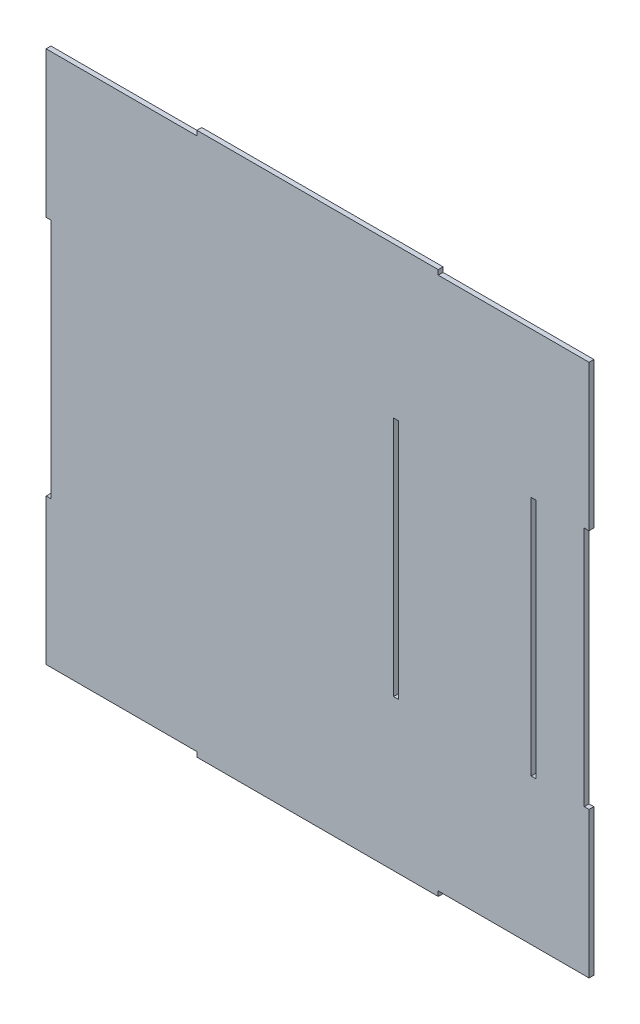
ISO-10303-21;
HEADER;
FILE_DESCRIPTION(('STEP AP214'),'2;1');
FILE_NAME('part.step','',(''),(''),'','','');
FILE_SCHEMA(('AUTOMOTIVE_DESIGN { 1 0 10303 214 1 1 1 1 }'));
ENDSEC;
DATA;
#1=APPLICATION_CONTEXT('core data for automotive mechanical design processes');
#2=APPLICATION_PROTOCOL_DEFINITION('international standard','automotive_design',2000,#1);
#3=PRODUCT_CONTEXT('',#1,'mechanical');
#4=PRODUCT('Part','Part','',(#3));
#5=PRODUCT_RELATED_PRODUCT_CATEGORY('part','',(#4));
#6=PRODUCT_DEFINITION_FORMATION('','',#4);
#7=PRODUCT_DEFINITION_CONTEXT('part definition',#1,'design');
#8=PRODUCT_DEFINITION('design','',#6,#7);
#9=PRODUCT_DEFINITION_SHAPE('','',#8);
#10=(LENGTH_UNIT() NAMED_UNIT(*) SI_UNIT(.MILLI.,.METRE.));
#11=(NAMED_UNIT(*) PLANE_ANGLE_UNIT() SI_UNIT($,.RADIAN.));
#12=(NAMED_UNIT(*) SI_UNIT($,.STERADIAN.) SOLID_ANGLE_UNIT());
#13=UNCERTAINTY_MEASURE_WITH_UNIT(LENGTH_MEASURE(1.E-05),#10,'distance_accuracy_value','');
#14=(GEOMETRIC_REPRESENTATION_CONTEXT(3) GLOBAL_UNCERTAINTY_ASSIGNED_CONTEXT((#13)) GLOBAL_UNIT_ASSIGNED_CONTEXT((#10,
#11,#12)) REPRESENTATION_CONTEXT('',''));
#15=CARTESIAN_POINT('',(0.,0.,0.));
#16=DIRECTION('',(0.,0.,1.));
#17=DIRECTION('',(1.,0.,0.));
#18=AXIS2_PLACEMENT_3D('',#15,#16,#17);
#19=CARTESIAN_POINT('',(0.,0.,4.));
#20=DIRECTION('',(0.,0.,-1.));
#21=DIRECTION('',(-1.,0.,0.));
#22=AXIS2_PLACEMENT_3D('',#19,#20,#21);
#23=PLANE('',#22);
#24=DIRECTION('',(0.,1.,0.));
#25=VECTOR('',#24,1.);
#26=CARTESIAN_POINT('',(39.0458140767459,92.4668914557469,4.));
#27=LINE('',#26,#25);
#28=CARTESIAN_POINT('',(39.0458140767459,-107.533108544253,4.));
#29=VERTEX_POINT('',#28);
#30=CARTESIAN_POINT('',(39.0458140767459,92.4668914557469,4.));
#31=VERTEX_POINT('',#30);
#32=EDGE_CURVE('E264',#29,#31,#27,.T.);
#33=ORIENTED_EDGE('',*,*,#32,.F.);
#34=DIRECTION('',(1.,0.,0.));
#35=VECTOR('',#34,1.);
#36=CARTESIAN_POINT('',(39.0458140767459,-107.533108544253,4.));
#37=LINE('',#36,#35);
#38=CARTESIAN_POINT('',(35.0458140767459,-107.533108544253,4.));
#39=VERTEX_POINT('',#38);
#40=EDGE_CURVE('E272',#39,#29,#37,.T.);
#41=ORIENTED_EDGE('',*,*,#40,.F.);
#42=DIRECTION('',(0.,-1.,0.));
#43=VECTOR('',#42,1.);
#44=CARTESIAN_POINT('',(35.0458140767459,92.4668914557469,4.));
#45=LINE('',#44,#43);
#46=CARTESIAN_POINT('',(35.0458140767459,92.4668914557469,4.));
#47=VERTEX_POINT('',#46);
#48=EDGE_CURVE('E269',#47,#39,#45,.T.);
#49=ORIENTED_EDGE('',*,*,#48,.F.);
#50=DIRECTION('',(-1.,0.,0.));
#51=VECTOR('',#50,1.);
#52=CARTESIAN_POINT('',(39.0458140767459,92.4668914557469,4.));
#53=LINE('',#52,#51);
#54=EDGE_CURVE('E266',#31,#47,#53,.T.);
#55=ORIENTED_EDGE('',*,*,#54,.F.);
#56=EDGE_LOOP('',(#33,#41,#49,#55));
#57=FACE_BOUND('',#56,.T.);
#58=DIRECTION('',(0.,-1.,0.));
#59=VECTOR('',#58,1.);
#60=CARTESIAN_POINT('',(-248.954185923254,92.4668914557465,4.));
#61=LINE('',#60,#59);
#62=CARTESIAN_POINT('',(-248.954185923254,92.4668914557465,4.));
#63=VERTEX_POINT('',#62);
#64=CARTESIAN_POINT('',(-248.954185923254,-107.533108544254,4.));
#65=VERTEX_POINT('',#64);
#66=EDGE_CURVE('E295',#63,#65,#61,.T.);
#67=ORIENTED_EDGE('',*,*,#66,.T.);
#68=DIRECTION('',(-1.,0.,0.));
#69=VECTOR('',#68,1.);
#70=CARTESIAN_POINT('',(-248.954185923254,-107.533108544254,4.));
#71=LINE('',#70,#69);
#72=CARTESIAN_POINT('',(-252.954185923254,-107.533108544254,4.));
#73=VERTEX_POINT('',#72);
#74=EDGE_CURVE('E298',#65,#73,#71,.T.);
#75=ORIENTED_EDGE('',*,*,#74,.T.);
#76=DIRECTION('',(0.,-1.,0.));
#77=VECTOR('',#76,1.);
#78=CARTESIAN_POINT('',(-252.954185923254,-107.533108544254,4.));
#79=LINE('',#78,#77);
#80=CARTESIAN_POINT('',(-252.954185923254,-228.533108544254,4.));
#81=VERTEX_POINT('',#80);
#82=EDGE_CURVE('E301',#73,#81,#79,.T.);
#83=ORIENTED_EDGE('',*,*,#82,.T.);
#84=DIRECTION('',(1.,0.,0.));
#85=VECTOR('',#84,1.);
#86=CARTESIAN_POINT('',(-252.954185923254,-228.533108544254,4.));
#87=LINE('',#86,#85);
#88=CARTESIAN_POINT('',(-127.954185923254,-228.533108544254,4.));
#89=VERTEX_POINT('',#88);
#90=EDGE_CURVE('E303',#81,#89,#87,.T.);
#91=ORIENTED_EDGE('',*,*,#90,.T.);
#92=DIRECTION('',(0.,-1.,0.));
#93=VECTOR('',#92,1.);
#94=CARTESIAN_POINT('',(-127.954185923254,-228.533108544254,4.));
#95=LINE('',#94,#93);
#96=CARTESIAN_POINT('',(-127.954185923254,-232.533108544254,4.));
#97=VERTEX_POINT('',#96);
#98=EDGE_CURVE('E305',#89,#97,#95,.T.);
#99=ORIENTED_EDGE('',*,*,#98,.T.);
#100=DIRECTION('',(1.,0.,0.));
#101=VECTOR('',#100,1.);
#102=CARTESIAN_POINT('',(-127.954185923254,-232.533108544254,4.));
#103=LINE('',#102,#101);
#104=CARTESIAN_POINT('',(72.0458140767459,-232.533108544254,4.));
#105=VERTEX_POINT('',#104);
#106=EDGE_CURVE('E307',#97,#105,#103,.T.);
#107=ORIENTED_EDGE('',*,*,#106,.T.);
#108=DIRECTION('',(0.,1.,0.));
#109=VECTOR('',#108,1.);
#110=CARTESIAN_POINT('',(72.0458140767459,-232.533108544254,4.));
#111=LINE('',#110,#109);
#112=CARTESIAN_POINT('',(72.0458140767459,-228.533108544254,4.));
#113=VERTEX_POINT('',#112);
#114=EDGE_CURVE('E309',#105,#113,#111,.T.);
#115=ORIENTED_EDGE('',*,*,#114,.T.);
#116=DIRECTION('',(1.,0.,0.));
#117=VECTOR('',#116,1.);
#118=CARTESIAN_POINT('',(72.0458140767459,-228.533108544254,4.));
#119=LINE('',#118,#117);
#120=CARTESIAN_POINT('',(197.045814076746,-228.533108544254,4.));
#121=VERTEX_POINT('',#120);
#122=EDGE_CURVE('E311',#113,#121,#119,.T.);
#123=ORIENTED_EDGE('',*,*,#122,.T.);
#124=DIRECTION('',(0.,1.,0.));
#125=VECTOR('',#124,1.);
#126=CARTESIAN_POINT('',(197.045814076746,-228.533108544254,4.));
#127=LINE('',#126,#125);
#128=CARTESIAN_POINT('',(197.045814076746,-107.533108544254,4.));
#129=VERTEX_POINT('',#128);
#130=EDGE_CURVE('E313',#121,#129,#127,.T.);
#131=ORIENTED_EDGE('',*,*,#130,.T.);
#132=DIRECTION('',(-1.,0.,0.));
#133=VECTOR('',#132,1.);
#134=CARTESIAN_POINT('',(197.045814076746,-107.533108544254,4.));
#135=LINE('',#134,#133);
#136=CARTESIAN_POINT('',(193.045814076746,-107.533108544254,4.));
#137=VERTEX_POINT('',#136);
#138=EDGE_CURVE('E315',#129,#137,#135,.T.);
#139=ORIENTED_EDGE('',*,*,#138,.T.);
#140=DIRECTION('',(0.,1.,0.));
#141=VECTOR('',#140,1.);
#142=CARTESIAN_POINT('',(193.045814076746,-107.533108544254,4.));
#143=LINE('',#142,#141);
#144=CARTESIAN_POINT('',(193.045814076746,92.4668914557465,4.));
#145=VERTEX_POINT('',#144);
#146=EDGE_CURVE('E317',#137,#145,#143,.T.);
#147=ORIENTED_EDGE('',*,*,#146,.T.);
#148=DIRECTION('',(1.,0.,0.));
#149=VECTOR('',#148,1.);
#150=CARTESIAN_POINT('',(193.045814076746,92.4668914557465,4.));
#151=LINE('',#150,#149);
#152=CARTESIAN_POINT('',(197.045814076746,92.4668914557465,4.));
#153=VERTEX_POINT('',#152);
#154=EDGE_CURVE('E319',#145,#153,#151,.T.);
#155=ORIENTED_EDGE('',*,*,#154,.T.);
#156=DIRECTION('',(0.,1.,0.));
#157=VECTOR('',#156,1.);
#158=CARTESIAN_POINT('',(197.045814076746,92.4668914557465,4.));
#159=LINE('',#158,#157);
#160=CARTESIAN_POINT('',(197.045814076746,213.466891455746,4.));
#161=VERTEX_POINT('',#160);
#162=EDGE_CURVE('E321',#153,#161,#159,.T.);
#163=ORIENTED_EDGE('',*,*,#162,.T.);
#164=DIRECTION('',(-1.,0.,0.));
#165=VECTOR('',#164,1.);
#166=CARTESIAN_POINT('',(197.045814076746,213.466891455746,4.));
#167=LINE('',#166,#165);
#168=CARTESIAN_POINT('',(72.0458140767458,213.466891455746,4.));
#169=VERTEX_POINT('',#168);
#170=EDGE_CURVE('E323',#161,#169,#167,.T.);
#171=ORIENTED_EDGE('',*,*,#170,.T.);
#172=DIRECTION('',(0.,1.,0.));
#173=VECTOR('',#172,1.);
#174=CARTESIAN_POINT('',(72.0458140767458,213.466891455746,4.));
#175=LINE('',#174,#173);
#176=CARTESIAN_POINT('',(72.0458140767458,217.466891455746,4.));
#177=VERTEX_POINT('',#176);
#178=EDGE_CURVE('E325',#169,#177,#175,.T.);
#179=ORIENTED_EDGE('',*,*,#178,.T.);
#180=DIRECTION('',(-1.,0.,0.));
#181=VECTOR('',#180,1.);
#182=CARTESIAN_POINT('',(72.0458140767458,217.466891455746,4.));
#183=LINE('',#182,#181);
#184=CARTESIAN_POINT('',(-127.954185923254,217.466891455746,4.));
#185=VERTEX_POINT('',#184);
#186=EDGE_CURVE('E327',#177,#185,#183,.T.);
#187=ORIENTED_EDGE('',*,*,#186,.T.);
#188=DIRECTION('',(0.,-1.,0.));
#189=VECTOR('',#188,1.);
#190=CARTESIAN_POINT('',(-127.954185923254,217.466891455746,4.));
#191=LINE('',#190,#189);
#192=CARTESIAN_POINT('',(-127.954185923254,213.466891455746,4.));
#193=VERTEX_POINT('',#192);
#194=EDGE_CURVE('E329',#185,#193,#191,.T.);
#195=ORIENTED_EDGE('',*,*,#194,.T.);
#196=DIRECTION('',(-1.,0.,0.));
#197=VECTOR('',#196,1.);
#198=CARTESIAN_POINT('',(-127.954185923254,213.466891455746,4.));
#199=LINE('',#198,#197);
#200=CARTESIAN_POINT('',(-252.954185923254,213.466891455746,4.));
#201=VERTEX_POINT('',#200);
#202=EDGE_CURVE('E331',#193,#201,#199,.T.);
#203=ORIENTED_EDGE('',*,*,#202,.T.);
#204=DIRECTION('',(0.,-1.,0.));
#205=VECTOR('',#204,1.);
#206=CARTESIAN_POINT('',(-252.954185923254,213.466891455746,4.));
#207=LINE('',#206,#205);
#208=CARTESIAN_POINT('',(-252.954185923254,92.4668914557465,4.));
#209=VERTEX_POINT('',#208);
#210=EDGE_CURVE('E333',#201,#209,#207,.T.);
#211=ORIENTED_EDGE('',*,*,#210,.T.);
#212=DIRECTION('',(1.,0.,0.));
#213=VECTOR('',#212,1.);
#214=CARTESIAN_POINT('',(-252.954185923254,92.4668914557465,4.));
#215=LINE('',#214,#213);
#216=EDGE_CURVE('E335',#209,#63,#215,.T.);
#217=ORIENTED_EDGE('',*,*,#216,.T.);
#218=EDGE_LOOP('',(#67,#75,#83,#91,#99,#107,#115,#123,#131,#139,#147,#155,#163,#171,#179,#187,
#195,#203,#211,#217));
#219=FACE_BOUND('',#218,.T.);
#220=DIRECTION('',(0.,-1.,0.));
#221=VECTOR('',#220,1.);
#222=CARTESIAN_POINT('',(149.045814076746,92.4668914557469,4.));
#223=LINE('',#222,#221);
#224=CARTESIAN_POINT('',(149.045814076746,92.4668914557469,4.));
#225=VERTEX_POINT('',#224);
#226=CARTESIAN_POINT('',(149.045814076746,-107.533108544253,4.));
#227=VERTEX_POINT('',#226);
#228=EDGE_CURVE('E228',#225,#227,#223,.T.);
#229=ORIENTED_EDGE('',*,*,#228,.F.);
#230=DIRECTION('',(-1.,0.,0.));
#231=VECTOR('',#230,1.);
#232=CARTESIAN_POINT('',(149.045814076746,92.4668914557469,4.));
#233=LINE('',#232,#231);
#234=CARTESIAN_POINT('',(153.045814076746,92.4668914557469,4.));
#235=VERTEX_POINT('',#234);
#236=EDGE_CURVE('E250',#235,#225,#233,.T.);
#237=ORIENTED_EDGE('',*,*,#236,.F.);
#238=DIRECTION('',(0.,1.,0.));
#239=VECTOR('',#238,1.);
#240=CARTESIAN_POINT('',(153.045814076746,92.4668914557469,4.));
#241=LINE('',#240,#239);
#242=CARTESIAN_POINT('',(153.045814076746,-107.533108544253,4.));
#243=VERTEX_POINT('',#242);
#244=EDGE_CURVE('E248',#243,#235,#241,.T.);
#245=ORIENTED_EDGE('',*,*,#244,.F.);
#246=DIRECTION('',(1.,0.,0.));
#247=VECTOR('',#246,1.);
#248=CARTESIAN_POINT('',(149.045814076746,-107.533108544253,4.));
#249=LINE('',#248,#247);
#250=EDGE_CURVE('E236',#227,#243,#249,.T.);
#251=ORIENTED_EDGE('',*,*,#250,.F.);
#252=EDGE_LOOP('',(#229,#237,#245,#251));
#253=FACE_BOUND('',#252,.T.);
#254=ADVANCED_FACE('F43',(#57,#219,#253),#23,.F.);
#255=CARTESIAN_POINT('',(0.,0.,0.));
#256=DIRECTION('',(0.,0.,-1.));
#257=DIRECTION('',(-1.,0.,0.));
#258=AXIS2_PLACEMENT_3D('',#255,#256,#257);
#259=PLANE('',#258);
#260=DIRECTION('',(0.,-1.,0.));
#261=VECTOR('',#260,1.);
#262=CARTESIAN_POINT('',(-248.954185923254,92.4668914557465,0.));
#263=LINE('',#262,#261);
#264=CARTESIAN_POINT('',(-248.954185923254,92.4668914557465,0.));
#265=VERTEX_POINT('',#264);
#266=CARTESIAN_POINT('',(-248.954185923254,-107.533108544254,0.));
#267=VERTEX_POINT('',#266);
#268=EDGE_CURVE('E294',#265,#267,#263,.T.);
#269=ORIENTED_EDGE('',*,*,#268,.F.);
#270=DIRECTION('',(1.,0.,0.));
#271=VECTOR('',#270,1.);
#272=CARTESIAN_POINT('',(-252.954185923254,92.4668914557465,0.));
#273=LINE('',#272,#271);
#274=CARTESIAN_POINT('',(-252.954185923254,92.4668914557465,0.));
#275=VERTEX_POINT('',#274);
#276=EDGE_CURVE('E299',#275,#265,#273,.T.);
#277=ORIENTED_EDGE('',*,*,#276,.F.);
#278=DIRECTION('',(0.,-1.,0.));
#279=VECTOR('',#278,1.);
#280=CARTESIAN_POINT('',(-252.954185923254,213.466891455746,0.));
#281=LINE('',#280,#279);
#282=CARTESIAN_POINT('',(-252.954185923254,213.466891455746,0.));
#283=VERTEX_POINT('',#282);
#284=EDGE_CURVE('E374',#283,#275,#281,.T.);
#285=ORIENTED_EDGE('',*,*,#284,.F.);
#286=DIRECTION('',(-1.,0.,0.));
#287=VECTOR('',#286,1.);
#288=CARTESIAN_POINT('',(-127.954185923254,213.466891455746,0.));
#289=LINE('',#288,#287);
#290=CARTESIAN_POINT('',(-127.954185923254,213.466891455746,0.));
#291=VERTEX_POINT('',#290);
#292=EDGE_CURVE('E372',#291,#283,#289,.T.);
#293=ORIENTED_EDGE('',*,*,#292,.F.);
#294=DIRECTION('',(0.,-1.,0.));
#295=VECTOR('',#294,1.);
#296=CARTESIAN_POINT('',(-127.954185923254,217.466891455746,0.));
#297=LINE('',#296,#295);
#298=CARTESIAN_POINT('',(-127.954185923254,217.466891455746,0.));
#299=VERTEX_POINT('',#298);
#300=EDGE_CURVE('E370',#299,#291,#297,.T.);
#301=ORIENTED_EDGE('',*,*,#300,.F.);
#302=DIRECTION('',(-1.,0.,0.));
#303=VECTOR('',#302,1.);
#304=CARTESIAN_POINT('',(72.0458140767458,217.466891455746,0.));
#305=LINE('',#304,#303);
#306=CARTESIAN_POINT('',(72.0458140767458,217.466891455746,0.));
#307=VERTEX_POINT('',#306);
#308=EDGE_CURVE('E368',#307,#299,#305,.T.);
#309=ORIENTED_EDGE('',*,*,#308,.F.);
#310=DIRECTION('',(0.,1.,0.));
#311=VECTOR('',#310,1.);
#312=CARTESIAN_POINT('',(72.0458140767458,213.466891455746,0.));
#313=LINE('',#312,#311);
#314=CARTESIAN_POINT('',(72.0458140767458,213.466891455746,0.));
#315=VERTEX_POINT('',#314);
#316=EDGE_CURVE('E366',#315,#307,#313,.T.);
#317=ORIENTED_EDGE('',*,*,#316,.F.);
#318=DIRECTION('',(-1.,0.,0.));
#319=VECTOR('',#318,1.);
#320=CARTESIAN_POINT('',(197.045814076746,213.466891455746,0.));
#321=LINE('',#320,#319);
#322=CARTESIAN_POINT('',(197.045814076746,213.466891455746,0.));
#323=VERTEX_POINT('',#322);
#324=EDGE_CURVE('E364',#323,#315,#321,.T.);
#325=ORIENTED_EDGE('',*,*,#324,.F.);
#326=DIRECTION('',(0.,1.,0.));
#327=VECTOR('',#326,1.);
#328=CARTESIAN_POINT('',(197.045814076746,92.4668914557465,0.));
#329=LINE('',#328,#327);
#330=CARTESIAN_POINT('',(197.045814076746,92.4668914557465,0.));
#331=VERTEX_POINT('',#330);
#332=EDGE_CURVE('E362',#331,#323,#329,.T.);
#333=ORIENTED_EDGE('',*,*,#332,.F.);
#334=DIRECTION('',(1.,0.,0.));
#335=VECTOR('',#334,1.);
#336=CARTESIAN_POINT('',(193.045814076746,92.4668914557465,0.));
#337=LINE('',#336,#335);
#338=CARTESIAN_POINT('',(193.045814076746,92.4668914557465,0.));
#339=VERTEX_POINT('',#338);
#340=EDGE_CURVE('E360',#339,#331,#337,.T.);
#341=ORIENTED_EDGE('',*,*,#340,.F.);
#342=DIRECTION('',(0.,1.,0.));
#343=VECTOR('',#342,1.);
#344=CARTESIAN_POINT('',(193.045814076746,-107.533108544254,0.));
#345=LINE('',#344,#343);
#346=CARTESIAN_POINT('',(193.045814076746,-107.533108544254,0.));
#347=VERTEX_POINT('',#346);
#348=EDGE_CURVE('E358',#347,#339,#345,.T.);
#349=ORIENTED_EDGE('',*,*,#348,.F.);
#350=DIRECTION('',(-1.,0.,0.));
#351=VECTOR('',#350,1.);
#352=CARTESIAN_POINT('',(197.045814076746,-107.533108544254,0.));
#353=LINE('',#352,#351);
#354=CARTESIAN_POINT('',(197.045814076746,-107.533108544254,0.));
#355=VERTEX_POINT('',#354);
#356=EDGE_CURVE('E356',#355,#347,#353,.T.);
#357=ORIENTED_EDGE('',*,*,#356,.F.);
#358=DIRECTION('',(0.,1.,0.));
#359=VECTOR('',#358,1.);
#360=CARTESIAN_POINT('',(197.045814076746,-228.533108544254,0.));
#361=LINE('',#360,#359);
#362=CARTESIAN_POINT('',(197.045814076746,-228.533108544254,0.));
#363=VERTEX_POINT('',#362);
#364=EDGE_CURVE('E354',#363,#355,#361,.T.);
#365=ORIENTED_EDGE('',*,*,#364,.F.);
#366=DIRECTION('',(1.,0.,0.));
#367=VECTOR('',#366,1.);
#368=CARTESIAN_POINT('',(72.0458140767459,-228.533108544254,0.));
#369=LINE('',#368,#367);
#370=CARTESIAN_POINT('',(72.0458140767459,-228.533108544254,0.));
#371=VERTEX_POINT('',#370);
#372=EDGE_CURVE('E352',#371,#363,#369,.T.);
#373=ORIENTED_EDGE('',*,*,#372,.F.);
#374=DIRECTION('',(0.,1.,0.));
#375=VECTOR('',#374,1.);
#376=CARTESIAN_POINT('',(72.0458140767459,-232.533108544254,0.));
#377=LINE('',#376,#375);
#378=CARTESIAN_POINT('',(72.0458140767459,-232.533108544254,0.));
#379=VERTEX_POINT('',#378);
#380=EDGE_CURVE('E350',#379,#371,#377,.T.);
#381=ORIENTED_EDGE('',*,*,#380,.F.);
#382=DIRECTION('',(1.,0.,0.));
#383=VECTOR('',#382,1.);
#384=CARTESIAN_POINT('',(-127.954185923254,-232.533108544254,0.));
#385=LINE('',#384,#383);
#386=CARTESIAN_POINT('',(-127.954185923254,-232.533108544254,0.));
#387=VERTEX_POINT('',#386);
#388=EDGE_CURVE('E348',#387,#379,#385,.T.);
#389=ORIENTED_EDGE('',*,*,#388,.F.);
#390=DIRECTION('',(0.,-1.,0.));
#391=VECTOR('',#390,1.);
#392=CARTESIAN_POINT('',(-127.954185923254,-228.533108544254,0.));
#393=LINE('',#392,#391);
#394=CARTESIAN_POINT('',(-127.954185923254,-228.533108544254,0.));
#395=VERTEX_POINT('',#394);
#396=EDGE_CURVE('E346',#395,#387,#393,.T.);
#397=ORIENTED_EDGE('',*,*,#396,.F.);
#398=DIRECTION('',(1.,0.,0.));
#399=VECTOR('',#398,1.);
#400=CARTESIAN_POINT('',(-252.954185923254,-228.533108544254,0.));
#401=LINE('',#400,#399);
#402=CARTESIAN_POINT('',(-252.954185923254,-228.533108544254,0.));
#403=VERTEX_POINT('',#402);
#404=EDGE_CURVE('E344',#403,#395,#401,.T.);
#405=ORIENTED_EDGE('',*,*,#404,.F.);
#406=DIRECTION('',(0.,-1.,0.));
#407=VECTOR('',#406,1.);
#408=CARTESIAN_POINT('',(-252.954185923254,-107.533108544254,0.));
#409=LINE('',#408,#407);
#410=CARTESIAN_POINT('',(-252.954185923254,-107.533108544254,0.));
#411=VERTEX_POINT('',#410);
#412=EDGE_CURVE('E342',#411,#403,#409,.T.);
#413=ORIENTED_EDGE('',*,*,#412,.F.);
#414=DIRECTION('',(-1.,0.,0.));
#415=VECTOR('',#414,1.);
#416=CARTESIAN_POINT('',(-248.954185923254,-107.533108544254,0.));
#417=LINE('',#416,#415);
#418=EDGE_CURVE('E340',#267,#411,#417,.T.);
#419=ORIENTED_EDGE('',*,*,#418,.F.);
#420=EDGE_LOOP('',(#269,#277,#285,#293,#301,#309,#317,#325,#333,#341,#349,#357,#365,#373,#381,
#389,#397,#405,#413,#419));
#421=FACE_BOUND('',#420,.T.);
#422=DIRECTION('',(1.,0.,0.));
#423=VECTOR('',#422,1.);
#424=CARTESIAN_POINT('',(39.0458140767459,-107.533108544253,0.));
#425=LINE('',#424,#423);
#426=CARTESIAN_POINT('',(35.0458140767459,-107.533108544253,0.));
#427=VERTEX_POINT('',#426);
#428=CARTESIAN_POINT('',(39.0458140767459,-107.533108544253,0.));
#429=VERTEX_POINT('',#428);
#430=EDGE_CURVE('E267',#427,#429,#425,.T.);
#431=ORIENTED_EDGE('',*,*,#430,.T.);
#432=DIRECTION('',(0.,1.,0.));
#433=VECTOR('',#432,1.);
#434=CARTESIAN_POINT('',(39.0458140767459,92.4668914557469,0.));
#435=LINE('',#434,#433);
#436=CARTESIAN_POINT('',(39.0458140767459,92.4668914557469,0.));
#437=VERTEX_POINT('',#436);
#438=EDGE_CURVE('E244',#429,#437,#435,.T.);
#439=ORIENTED_EDGE('',*,*,#438,.T.);
#440=DIRECTION('',(-1.,0.,0.));
#441=VECTOR('',#440,1.);
#442=CARTESIAN_POINT('',(39.0458140767459,92.4668914557469,0.));
#443=LINE('',#442,#441);
#444=CARTESIAN_POINT('',(35.0458140767459,92.4668914557469,0.));
#445=VERTEX_POINT('',#444);
#446=EDGE_CURVE('E277',#437,#445,#443,.T.);
#447=ORIENTED_EDGE('',*,*,#446,.T.);
#448=DIRECTION('',(0.,-1.,0.));
#449=VECTOR('',#448,1.);
#450=CARTESIAN_POINT('',(35.0458140767459,92.4668914557469,0.));
#451=LINE('',#450,#449);
#452=EDGE_CURVE('E280',#445,#427,#451,.T.);
#453=ORIENTED_EDGE('',*,*,#452,.T.);
#454=EDGE_LOOP('',(#431,#439,#447,#453));
#455=FACE_BOUND('',#454,.T.);
#456=DIRECTION('',(-1.,0.,0.));
#457=VECTOR('',#456,1.);
#458=CARTESIAN_POINT('',(149.045814076746,92.4668914557469,0.));
#459=LINE('',#458,#457);
#460=CARTESIAN_POINT('',(153.045814076746,92.4668914557469,0.));
#461=VERTEX_POINT('',#460);
#462=CARTESIAN_POINT('',(149.045814076746,92.4668914557469,0.));
#463=VERTEX_POINT('',#462);
#464=EDGE_CURVE('E237',#461,#463,#459,.T.);
#465=ORIENTED_EDGE('',*,*,#464,.T.);
#466=DIRECTION('',(0.,-1.,0.));
#467=VECTOR('',#466,1.);
#468=CARTESIAN_POINT('',(149.045814076746,92.4668914557469,0.));
#469=LINE('',#468,#467);
#470=CARTESIAN_POINT('',(149.045814076746,-107.533108544253,0.));
#471=VERTEX_POINT('',#470);
#472=EDGE_CURVE('E66',#463,#471,#469,.T.);
#473=ORIENTED_EDGE('',*,*,#472,.T.);
#474=DIRECTION('',(1.,0.,0.));
#475=VECTOR('',#474,1.);
#476=CARTESIAN_POINT('',(149.045814076746,-107.533108544253,0.));
#477=LINE('',#476,#475);
#478=CARTESIAN_POINT('',(153.045814076746,-107.533108544253,0.));
#479=VERTEX_POINT('',#478);
#480=EDGE_CURVE('E243',#471,#479,#477,.T.);
#481=ORIENTED_EDGE('',*,*,#480,.T.);
#482=DIRECTION('',(0.,1.,0.));
#483=VECTOR('',#482,1.);
#484=CARTESIAN_POINT('',(153.045814076746,92.4668914557469,0.));
#485=LINE('',#484,#483);
#486=EDGE_CURVE('E256',#479,#461,#485,.T.);
#487=ORIENTED_EDGE('',*,*,#486,.T.);
#488=EDGE_LOOP('',(#465,#473,#481,#487));
#489=FACE_BOUND('',#488,.T.);
#490=ADVANCED_FACE('F440',(#421,#455,#489),#259,.T.);
#491=CARTESIAN_POINT('',(-248.954185923254,92.4668914557465,4.));
#492=DIRECTION('',(1.,0.,0.));
#493=DIRECTION('',(0.,1.,0.));
#494=AXIS2_PLACEMENT_3D('',#491,#492,#493);
#495=PLANE('',#494);
#496=ORIENTED_EDGE('',*,*,#268,.T.);
#497=DIRECTION('',(0.,0.,-1.));
#498=VECTOR('',#497,1.);
#499=CARTESIAN_POINT('',(-248.954185923254,-107.533108544254,4.));
#500=LINE('',#499,#498);
#501=EDGE_CURVE('E11',#65,#267,#500,.T.);
#502=ORIENTED_EDGE('',*,*,#501,.F.);
#503=ORIENTED_EDGE('',*,*,#66,.F.);
#504=DIRECTION('',(0.,0.,-1.));
#505=VECTOR('',#504,1.);
#506=CARTESIAN_POINT('',(-248.954185923254,92.4668914557465,4.));
#507=LINE('',#506,#505);
#508=EDGE_CURVE('E337',#63,#265,#507,.T.);
#509=ORIENTED_EDGE('',*,*,#508,.T.);
#510=EDGE_LOOP('',(#496,#502,#503,#509));
#511=FACE_BOUND('',#510,.T.);
#512=ADVANCED_FACE('F45',(#511),#495,.F.);
#513=CARTESIAN_POINT('',(-248.954185923254,-107.533108544254,4.));
#514=DIRECTION('',(0.,-1.,0.));
#515=DIRECTION('',(0.,0.,-1.));
#516=AXIS2_PLACEMENT_3D('',#513,#514,#515);
#517=PLANE('',#516);
#518=ORIENTED_EDGE('',*,*,#418,.T.);
#519=DIRECTION('',(0.,0.,-1.));
#520=VECTOR('',#519,1.);
#521=CARTESIAN_POINT('',(-252.954185923254,-107.533108544254,4.));
#522=LINE('',#521,#520);
#523=EDGE_CURVE('E51',#73,#411,#522,.T.);
#524=ORIENTED_EDGE('',*,*,#523,.F.);
#525=ORIENTED_EDGE('',*,*,#74,.F.);
#526=ORIENTED_EDGE('',*,*,#501,.T.);
#527=EDGE_LOOP('',(#518,#524,#525,#526));
#528=FACE_BOUND('',#527,.T.);
#529=ADVANCED_FACE('F457',(#528),#517,.F.);
#530=CARTESIAN_POINT('',(-252.954185923254,-107.533108544254,4.));
#531=DIRECTION('',(1.,0.,0.));
#532=DIRECTION('',(0.,1.,0.));
#533=AXIS2_PLACEMENT_3D('',#530,#531,#532);
#534=PLANE('',#533);
#535=ORIENTED_EDGE('',*,*,#412,.T.);
#536=DIRECTION('',(0.,0.,-1.));
#537=VECTOR('',#536,1.);
#538=CARTESIAN_POINT('',(-252.954185923254,-228.533108544254,4.));
#539=LINE('',#538,#537);
#540=EDGE_CURVE('E427',#81,#403,#539,.T.);
#541=ORIENTED_EDGE('',*,*,#540,.F.);
#542=ORIENTED_EDGE('',*,*,#82,.F.);
#543=ORIENTED_EDGE('',*,*,#523,.T.);
#544=EDGE_LOOP('',(#535,#541,#542,#543));
#545=FACE_BOUND('',#544,.T.);
#546=ADVANCED_FACE('F434',(#545),#534,.F.);
#547=CARTESIAN_POINT('',(-252.954185923254,-228.533108544254,4.));
#548=DIRECTION('',(0.,1.,0.));
#549=DIRECTION('',(0.,0.,1.));
#550=AXIS2_PLACEMENT_3D('',#547,#548,#549);
#551=PLANE('',#550);
#552=ORIENTED_EDGE('',*,*,#404,.T.);
#553=DIRECTION('',(0.,0.,-1.));
#554=VECTOR('',#553,1.);
#555=CARTESIAN_POINT('',(-127.954185923254,-228.533108544254,4.));
#556=LINE('',#555,#554);
#557=EDGE_CURVE('E424',#89,#395,#556,.T.);
#558=ORIENTED_EDGE('',*,*,#557,.F.);
#559=ORIENTED_EDGE('',*,*,#90,.F.);
#560=ORIENTED_EDGE('',*,*,#540,.T.);
#561=EDGE_LOOP('',(#552,#558,#559,#560));
#562=FACE_BOUND('',#561,.T.);
#563=ADVANCED_FACE('F446',(#562),#551,.F.);
#564=CARTESIAN_POINT('',(-127.954185923254,-228.533108544254,4.));
#565=DIRECTION('',(1.,0.,0.));
#566=DIRECTION('',(0.,0.,-1.));
#567=AXIS2_PLACEMENT_3D('',#564,#565,#566);
#568=PLANE('',#567);
#569=ORIENTED_EDGE('',*,*,#396,.T.);
#570=DIRECTION('',(0.,0.,-1.));
#571=VECTOR('',#570,1.);
#572=CARTESIAN_POINT('',(-127.954185923254,-232.533108544254,4.));
#573=LINE('',#572,#571);
#574=EDGE_CURVE('E421',#97,#387,#573,.T.);
#575=ORIENTED_EDGE('',*,*,#574,.F.);
#576=ORIENTED_EDGE('',*,*,#98,.F.);
#577=ORIENTED_EDGE('',*,*,#557,.T.);
#578=EDGE_LOOP('',(#569,#575,#576,#577));
#579=FACE_BOUND('',#578,.T.);
#580=ADVANCED_FACE('F450',(#579),#568,.F.);
#581=CARTESIAN_POINT('',(-127.954185923254,-232.533108544254,4.));
#582=DIRECTION('',(0.,1.,0.));
#583=DIRECTION('',(0.,0.,1.));
#584=AXIS2_PLACEMENT_3D('',#581,#582,#583);
#585=PLANE('',#584);
#586=ORIENTED_EDGE('',*,*,#388,.T.);
#587=DIRECTION('',(0.,0.,-1.));
#588=VECTOR('',#587,1.);
#589=CARTESIAN_POINT('',(72.0458140767459,-232.533108544254,4.));
#590=LINE('',#589,#588);
#591=EDGE_CURVE('E418',#105,#379,#590,.T.);
#592=ORIENTED_EDGE('',*,*,#591,.F.);
#593=ORIENTED_EDGE('',*,*,#106,.F.);
#594=ORIENTED_EDGE('',*,*,#574,.T.);
#595=EDGE_LOOP('',(#586,#592,#593,#594));
#596=FACE_BOUND('',#595,.T.);
#597=ADVANCED_FACE('F530',(#596),#585,.F.);
#598=CARTESIAN_POINT('',(72.0458140767459,-232.533108544254,4.));
#599=DIRECTION('',(-1.,0.,0.));
#600=DIRECTION('',(0.,0.,1.));
#601=AXIS2_PLACEMENT_3D('',#598,#599,#600);
#602=PLANE('',#601);
#603=ORIENTED_EDGE('',*,*,#380,.T.);
#604=DIRECTION('',(0.,0.,-1.));
#605=VECTOR('',#604,1.);
#606=CARTESIAN_POINT('',(72.0458140767459,-228.533108544254,4.));
#607=LINE('',#606,#605);
#608=EDGE_CURVE('E415',#113,#371,#607,.T.);
#609=ORIENTED_EDGE('',*,*,#608,.F.);
#610=ORIENTED_EDGE('',*,*,#114,.F.);
#611=ORIENTED_EDGE('',*,*,#591,.T.);
#612=EDGE_LOOP('',(#603,#609,#610,#611));
#613=FACE_BOUND('',#612,.T.);
#614=ADVANCED_FACE('F528',(#613),#602,.F.);
#615=CARTESIAN_POINT('',(72.0458140767459,-228.533108544254,4.));
#616=DIRECTION('',(0.,1.,0.));
#617=DIRECTION('',(0.,0.,1.));
#618=AXIS2_PLACEMENT_3D('',#615,#616,#617);
#619=PLANE('',#618);
#620=ORIENTED_EDGE('',*,*,#372,.T.);
#621=DIRECTION('',(0.,0.,-1.));
#622=VECTOR('',#621,1.);
#623=CARTESIAN_POINT('',(197.045814076746,-228.533108544254,4.));
#624=LINE('',#623,#622);
#625=EDGE_CURVE('E412',#121,#363,#624,.T.);
#626=ORIENTED_EDGE('',*,*,#625,.F.);
#627=ORIENTED_EDGE('',*,*,#122,.F.);
#628=ORIENTED_EDGE('',*,*,#608,.T.);
#629=EDGE_LOOP('',(#620,#626,#627,#628));
#630=FACE_BOUND('',#629,.T.);
#631=ADVANCED_FACE('F523',(#630),#619,.F.);
#632=CARTESIAN_POINT('',(197.045814076746,-228.533108544254,4.));
#633=DIRECTION('',(-1.,0.,0.));
#634=DIRECTION('',(0.,0.,1.));
#635=AXIS2_PLACEMENT_3D('',#632,#633,#634);
#636=PLANE('',#635);
#637=ORIENTED_EDGE('',*,*,#364,.T.);
#638=DIRECTION('',(0.,0.,-1.));
#639=VECTOR('',#638,1.);
#640=CARTESIAN_POINT('',(197.045814076746,-107.533108544254,4.));
#641=LINE('',#640,#639);
#642=EDGE_CURVE('E409',#129,#355,#641,.T.);
#643=ORIENTED_EDGE('',*,*,#642,.F.);
#644=ORIENTED_EDGE('',*,*,#130,.F.);
#645=ORIENTED_EDGE('',*,*,#625,.T.);
#646=EDGE_LOOP('',(#637,#643,#644,#645));
#647=FACE_BOUND('',#646,.T.);
#648=ADVANCED_FACE('F518',(#647),#636,.F.);
#649=CARTESIAN_POINT('',(197.045814076746,-107.533108544254,4.));
#650=DIRECTION('',(0.,-1.,0.));
#651=DIRECTION('',(0.,0.,-1.));
#652=AXIS2_PLACEMENT_3D('',#649,#650,#651);
#653=PLANE('',#652);
#654=ORIENTED_EDGE('',*,*,#356,.T.);
#655=DIRECTION('',(0.,0.,-1.));
#656=VECTOR('',#655,1.);
#657=CARTESIAN_POINT('',(193.045814076746,-107.533108544254,4.));
#658=LINE('',#657,#656);
#659=EDGE_CURVE('E406',#137,#347,#658,.T.);
#660=ORIENTED_EDGE('',*,*,#659,.F.);
#661=ORIENTED_EDGE('',*,*,#138,.F.);
#662=ORIENTED_EDGE('',*,*,#642,.T.);
#663=EDGE_LOOP('',(#654,#660,#661,#662));
#664=FACE_BOUND('',#663,.T.);
#665=ADVANCED_FACE('F514',(#664),#653,.F.);
#666=CARTESIAN_POINT('',(193.045814076746,-107.533108544254,4.));
#667=DIRECTION('',(-1.,0.,0.));
#668=DIRECTION('',(0.,0.,1.));
#669=AXIS2_PLACEMENT_3D('',#666,#667,#668);
#670=PLANE('',#669);
#671=ORIENTED_EDGE('',*,*,#348,.T.);
#672=DIRECTION('',(0.,0.,-1.));
#673=VECTOR('',#672,1.);
#674=CARTESIAN_POINT('',(193.045814076746,92.4668914557465,4.));
#675=LINE('',#674,#673);
#676=EDGE_CURVE('E403',#145,#339,#675,.T.);
#677=ORIENTED_EDGE('',*,*,#676,.F.);
#678=ORIENTED_EDGE('',*,*,#146,.F.);
#679=ORIENTED_EDGE('',*,*,#659,.T.);
#680=EDGE_LOOP('',(#671,#677,#678,#679));
#681=FACE_BOUND('',#680,.T.);
#682=ADVANCED_FACE('F509',(#681),#670,.F.);
#683=CARTESIAN_POINT('',(193.045814076746,92.4668914557465,4.));
#684=DIRECTION('',(0.,1.,0.));
#685=DIRECTION('',(0.,0.,1.));
#686=AXIS2_PLACEMENT_3D('',#683,#684,#685);
#687=PLANE('',#686);
#688=ORIENTED_EDGE('',*,*,#340,.T.);
#689=DIRECTION('',(0.,0.,-1.));
#690=VECTOR('',#689,1.);
#691=CARTESIAN_POINT('',(197.045814076746,92.4668914557465,4.));
#692=LINE('',#691,#690);
#693=EDGE_CURVE('E400',#153,#331,#692,.T.);
#694=ORIENTED_EDGE('',*,*,#693,.F.);
#695=ORIENTED_EDGE('',*,*,#154,.F.);
#696=ORIENTED_EDGE('',*,*,#676,.T.);
#697=EDGE_LOOP('',(#688,#694,#695,#696));
#698=FACE_BOUND('',#697,.T.);
#699=ADVANCED_FACE('F503',(#698),#687,.F.);
#700=CARTESIAN_POINT('',(197.045814076746,92.4668914557465,4.));
#701=DIRECTION('',(-1.,0.,0.));
#702=DIRECTION('',(0.,0.,1.));
#703=AXIS2_PLACEMENT_3D('',#700,#701,#702);
#704=PLANE('',#703);
#705=ORIENTED_EDGE('',*,*,#332,.T.);
#706=DIRECTION('',(0.,0.,-1.));
#707=VECTOR('',#706,1.);
#708=CARTESIAN_POINT('',(197.045814076746,213.466891455746,4.));
#709=LINE('',#708,#707);
#710=EDGE_CURVE('E397',#161,#323,#709,.T.);
#711=ORIENTED_EDGE('',*,*,#710,.F.);
#712=ORIENTED_EDGE('',*,*,#162,.F.);
#713=ORIENTED_EDGE('',*,*,#693,.T.);
#714=EDGE_LOOP('',(#705,#711,#712,#713));
#715=FACE_BOUND('',#714,.T.);
#716=ADVANCED_FACE('F499',(#715),#704,.F.);
#717=CARTESIAN_POINT('',(197.045814076746,213.466891455746,4.));
#718=DIRECTION('',(0.,-1.,0.));
#719=DIRECTION('',(0.,0.,-1.));
#720=AXIS2_PLACEMENT_3D('',#717,#718,#719);
#721=PLANE('',#720);
#722=ORIENTED_EDGE('',*,*,#324,.T.);
#723=DIRECTION('',(0.,0.,-1.));
#724=VECTOR('',#723,1.);
#725=CARTESIAN_POINT('',(72.0458140767458,213.466891455746,4.));
#726=LINE('',#725,#724);
#727=EDGE_CURVE('E394',#169,#315,#726,.T.);
#728=ORIENTED_EDGE('',*,*,#727,.F.);
#729=ORIENTED_EDGE('',*,*,#170,.F.);
#730=ORIENTED_EDGE('',*,*,#710,.T.);
#731=EDGE_LOOP('',(#722,#728,#729,#730));
#732=FACE_BOUND('',#731,.T.);
#733=ADVANCED_FACE('F494',(#732),#721,.F.);
#734=CARTESIAN_POINT('',(72.0458140767458,213.466891455746,4.));
#735=DIRECTION('',(-1.,0.,0.));
#736=DIRECTION('',(0.,0.,1.));
#737=AXIS2_PLACEMENT_3D('',#734,#735,#736);
#738=PLANE('',#737);
#739=ORIENTED_EDGE('',*,*,#316,.T.);
#740=DIRECTION('',(0.,0.,-1.));
#741=VECTOR('',#740,1.);
#742=CARTESIAN_POINT('',(72.0458140767458,217.466891455746,4.));
#743=LINE('',#742,#741);
#744=EDGE_CURVE('E391',#177,#307,#743,.T.);
#745=ORIENTED_EDGE('',*,*,#744,.F.);
#746=ORIENTED_EDGE('',*,*,#178,.F.);
#747=ORIENTED_EDGE('',*,*,#727,.T.);
#748=EDGE_LOOP('',(#739,#745,#746,#747));
#749=FACE_BOUND('',#748,.T.);
#750=ADVANCED_FACE('F488',(#749),#738,.F.);
#751=CARTESIAN_POINT('',(72.0458140767458,217.466891455746,4.));
#752=DIRECTION('',(0.,-1.,0.));
#753=DIRECTION('',(0.,0.,-1.));
#754=AXIS2_PLACEMENT_3D('',#751,#752,#753);
#755=PLANE('',#754);
#756=ORIENTED_EDGE('',*,*,#308,.T.);
#757=DIRECTION('',(0.,0.,-1.));
#758=VECTOR('',#757,1.);
#759=CARTESIAN_POINT('',(-127.954185923254,217.466891455746,4.));
#760=LINE('',#759,#758);
#761=EDGE_CURVE('E388',#185,#299,#760,.T.);
#762=ORIENTED_EDGE('',*,*,#761,.F.);
#763=ORIENTED_EDGE('',*,*,#186,.F.);
#764=ORIENTED_EDGE('',*,*,#744,.T.);
#765=EDGE_LOOP('',(#756,#762,#763,#764));
#766=FACE_BOUND('',#765,.T.);
#767=ADVANCED_FACE('F484',(#766),#755,.F.);
#768=CARTESIAN_POINT('',(-127.954185923254,217.466891455746,4.));
#769=DIRECTION('',(1.,0.,0.));
#770=DIRECTION('',(0.,0.,-1.));
#771=AXIS2_PLACEMENT_3D('',#768,#769,#770);
#772=PLANE('',#771);
#773=ORIENTED_EDGE('',*,*,#300,.T.);
#774=DIRECTION('',(0.,0.,-1.));
#775=VECTOR('',#774,1.);
#776=CARTESIAN_POINT('',(-127.954185923254,213.466891455746,4.));
#777=LINE('',#776,#775);
#778=EDGE_CURVE('E385',#193,#291,#777,.T.);
#779=ORIENTED_EDGE('',*,*,#778,.F.);
#780=ORIENTED_EDGE('',*,*,#194,.F.);
#781=ORIENTED_EDGE('',*,*,#761,.T.);
#782=EDGE_LOOP('',(#773,#779,#780,#781));
#783=FACE_BOUND('',#782,.T.);
#784=ADVANCED_FACE('F479',(#783),#772,.F.);
#785=CARTESIAN_POINT('',(-127.954185923254,213.466891455746,4.));
#786=DIRECTION('',(0.,-1.,0.));
#787=DIRECTION('',(0.,0.,-1.));
#788=AXIS2_PLACEMENT_3D('',#785,#786,#787);
#789=PLANE('',#788);
#790=ORIENTED_EDGE('',*,*,#292,.T.);
#791=DIRECTION('',(0.,0.,-1.));
#792=VECTOR('',#791,1.);
#793=CARTESIAN_POINT('',(-252.954185923254,213.466891455746,4.));
#794=LINE('',#793,#792);
#795=EDGE_CURVE('E382',#201,#283,#794,.T.);
#796=ORIENTED_EDGE('',*,*,#795,.F.);
#797=ORIENTED_EDGE('',*,*,#202,.F.);
#798=ORIENTED_EDGE('',*,*,#778,.T.);
#799=EDGE_LOOP('',(#790,#796,#797,#798));
#800=FACE_BOUND('',#799,.T.);
#801=ADVANCED_FACE('F473',(#800),#789,.F.);
#802=CARTESIAN_POINT('',(-252.954185923254,213.466891455746,4.));
#803=DIRECTION('',(1.,0.,0.));
#804=DIRECTION('',(0.,0.,-1.));
#805=AXIS2_PLACEMENT_3D('',#802,#803,#804);
#806=PLANE('',#805);
#807=ORIENTED_EDGE('',*,*,#284,.T.);
#808=DIRECTION('',(0.,0.,-1.));
#809=VECTOR('',#808,1.);
#810=CARTESIAN_POINT('',(-252.954185923254,92.4668914557465,4.));
#811=LINE('',#810,#809);
#812=EDGE_CURVE('E379',#209,#275,#811,.T.);
#813=ORIENTED_EDGE('',*,*,#812,.F.);
#814=ORIENTED_EDGE('',*,*,#210,.F.);
#815=ORIENTED_EDGE('',*,*,#795,.T.);
#816=EDGE_LOOP('',(#807,#813,#814,#815));
#817=FACE_BOUND('',#816,.T.);
#818=ADVANCED_FACE('F469',(#817),#806,.F.);
#819=CARTESIAN_POINT('',(-252.954185923254,92.4668914557465,4.));
#820=DIRECTION('',(0.,1.,0.));
#821=DIRECTION('',(0.,0.,1.));
#822=AXIS2_PLACEMENT_3D('',#819,#820,#821);
#823=PLANE('',#822);
#824=ORIENTED_EDGE('',*,*,#276,.T.);
#825=ORIENTED_EDGE('',*,*,#508,.F.);
#826=ORIENTED_EDGE('',*,*,#216,.F.);
#827=ORIENTED_EDGE('',*,*,#812,.T.);
#828=EDGE_LOOP('',(#824,#825,#826,#827));
#829=FACE_BOUND('',#828,.T.);
#830=ADVANCED_FACE('F464',(#829),#823,.F.);
#831=CARTESIAN_POINT('',(39.0458140767459,92.4668914557469,4.));
#832=DIRECTION('',(-1.,0.,0.));
#833=DIRECTION('',(0.,0.,1.));
#834=AXIS2_PLACEMENT_3D('',#831,#832,#833);
#835=PLANE('',#834);
#836=ORIENTED_EDGE('',*,*,#438,.F.);
#837=DIRECTION('',(0.,0.,-1.));
#838=VECTOR('',#837,1.);
#839=CARTESIAN_POINT('',(39.0458140767459,-107.533108544253,4.));
#840=LINE('',#839,#838);
#841=EDGE_CURVE('E274',#29,#429,#840,.T.);
#842=ORIENTED_EDGE('',*,*,#841,.F.);
#843=ORIENTED_EDGE('',*,*,#32,.T.);
#844=DIRECTION('',(0.,0.,-1.));
#845=VECTOR('',#844,1.);
#846=CARTESIAN_POINT('',(39.0458140767459,92.4668914557469,4.));
#847=LINE('',#846,#845);
#848=EDGE_CURVE('E291',#31,#437,#847,.T.);
#849=ORIENTED_EDGE('',*,*,#848,.T.);
#850=EDGE_LOOP('',(#836,#842,#843,#849));
#851=FACE_BOUND('',#850,.T.);
#852=ADVANCED_FACE('F548',(#851),#835,.T.);
#853=CARTESIAN_POINT('',(39.0458140767459,92.4668914557469,4.));
#854=DIRECTION('',(0.,-1.,0.));
#855=DIRECTION('',(0.,0.,-1.));
#856=AXIS2_PLACEMENT_3D('',#853,#854,#855);
#857=PLANE('',#856);
#858=ORIENTED_EDGE('',*,*,#446,.F.);
#859=ORIENTED_EDGE('',*,*,#848,.F.);
#860=ORIENTED_EDGE('',*,*,#54,.T.);
#861=DIRECTION('',(0.,0.,-1.));
#862=VECTOR('',#861,1.);
#863=CARTESIAN_POINT('',(35.0458140767459,92.4668914557469,4.));
#864=LINE('',#863,#862);
#865=EDGE_CURVE('E289',#47,#445,#864,.T.);
#866=ORIENTED_EDGE('',*,*,#865,.T.);
#867=EDGE_LOOP('',(#858,#859,#860,#866));
#868=FACE_BOUND('',#867,.T.);
#869=ADVANCED_FACE('F634',(#868),#857,.T.);
#870=CARTESIAN_POINT('',(35.0458140767459,92.4668914557469,4.));
#871=DIRECTION('',(1.,0.,0.));
#872=DIRECTION('',(0.,0.,-1.));
#873=AXIS2_PLACEMENT_3D('',#870,#871,#872);
#874=PLANE('',#873);
#875=ORIENTED_EDGE('',*,*,#452,.F.);
#876=ORIENTED_EDGE('',*,*,#865,.F.);
#877=ORIENTED_EDGE('',*,*,#48,.T.);
#878=DIRECTION('',(0.,0.,-1.));
#879=VECTOR('',#878,1.);
#880=CARTESIAN_POINT('',(35.0458140767459,-107.533108544253,4.));
#881=LINE('',#880,#879);
#882=EDGE_CURVE('E287',#39,#427,#881,.T.);
#883=ORIENTED_EDGE('',*,*,#882,.T.);
#884=EDGE_LOOP('',(#875,#876,#877,#883));
#885=FACE_BOUND('',#884,.T.);
#886=ADVANCED_FACE('F641',(#885),#874,.T.);
#887=CARTESIAN_POINT('',(39.0458140767459,-107.533108544253,4.));
#888=DIRECTION('',(0.,1.,0.));
#889=DIRECTION('',(0.,0.,1.));
#890=AXIS2_PLACEMENT_3D('',#887,#888,#889);
#891=PLANE('',#890);
#892=ORIENTED_EDGE('',*,*,#430,.F.);
#893=ORIENTED_EDGE('',*,*,#882,.F.);
#894=ORIENTED_EDGE('',*,*,#40,.T.);
#895=ORIENTED_EDGE('',*,*,#841,.T.);
#896=EDGE_LOOP('',(#892,#893,#894,#895));
#897=FACE_BOUND('',#896,.T.);
#898=ADVANCED_FACE('F648',(#897),#891,.T.);
#899=CARTESIAN_POINT('',(149.045814076746,92.4668914557469,4.));
#900=DIRECTION('',(1.,0.,0.));
#901=DIRECTION('',(0.,1.,0.));
#902=AXIS2_PLACEMENT_3D('',#899,#900,#901);
#903=PLANE('',#902);
#904=ORIENTED_EDGE('',*,*,#472,.F.);
#905=DIRECTION('',(0.,0.,-1.));
#906=VECTOR('',#905,1.);
#907=CARTESIAN_POINT('',(149.045814076746,92.4668914557469,4.));
#908=LINE('',#907,#906);
#909=EDGE_CURVE('E232',#225,#463,#908,.T.);
#910=ORIENTED_EDGE('',*,*,#909,.F.);
#911=ORIENTED_EDGE('',*,*,#228,.T.);
#912=DIRECTION('',(0.,0.,-1.));
#913=VECTOR('',#912,1.);
#914=CARTESIAN_POINT('',(149.045814076746,-107.533108544253,4.));
#915=LINE('',#914,#913);
#916=EDGE_CURVE('E231',#227,#471,#915,.T.);
#917=ORIENTED_EDGE('',*,*,#916,.T.);
#918=EDGE_LOOP('',(#904,#910,#911,#917));
#919=FACE_BOUND('',#918,.T.);
#920=ADVANCED_FACE('F230',(#919),#903,.T.);
#921=CARTESIAN_POINT('',(149.045814076746,-107.533108544253,4.));
#922=DIRECTION('',(0.,1.,0.));
#923=DIRECTION('',(0.,0.,1.));
#924=AXIS2_PLACEMENT_3D('',#921,#922,#923);
#925=PLANE('',#924);
#926=ORIENTED_EDGE('',*,*,#480,.F.);
#927=ORIENTED_EDGE('',*,*,#916,.F.);
#928=ORIENTED_EDGE('',*,*,#250,.T.);
#929=DIRECTION('',(0.,0.,-1.));
#930=VECTOR('',#929,1.);
#931=CARTESIAN_POINT('',(153.045814076746,-107.533108544253,4.));
#932=LINE('',#931,#930);
#933=EDGE_CURVE('E245',#243,#479,#932,.T.);
#934=ORIENTED_EDGE('',*,*,#933,.T.);
#935=EDGE_LOOP('',(#926,#927,#928,#934));
#936=FACE_BOUND('',#935,.T.);
#937=ADVANCED_FACE('F240',(#936),#925,.T.);
#938=CARTESIAN_POINT('',(153.045814076746,92.4668914557469,4.));
#939=DIRECTION('',(-1.,0.,0.));
#940=DIRECTION('',(0.,-1.,0.));
#941=AXIS2_PLACEMENT_3D('',#938,#939,#940);
#942=PLANE('',#941);
#943=ORIENTED_EDGE('',*,*,#486,.F.);
#944=ORIENTED_EDGE('',*,*,#933,.F.);
#945=ORIENTED_EDGE('',*,*,#244,.T.);
#946=DIRECTION('',(0.,0.,-1.));
#947=VECTOR('',#946,1.);
#948=CARTESIAN_POINT('',(153.045814076746,92.4668914557469,4.));
#949=LINE('',#948,#947);
#950=EDGE_CURVE('E58',#235,#461,#949,.T.);
#951=ORIENTED_EDGE('',*,*,#950,.T.);
#952=EDGE_LOOP('',(#943,#944,#945,#951));
#953=FACE_BOUND('',#952,.T.);
#954=ADVANCED_FACE('F669',(#953),#942,.T.);
#955=CARTESIAN_POINT('',(149.045814076746,92.4668914557469,4.));
#956=DIRECTION('',(0.,-1.,0.));
#957=DIRECTION('',(0.,0.,-1.));
#958=AXIS2_PLACEMENT_3D('',#955,#956,#957);
#959=PLANE('',#958);
#960=ORIENTED_EDGE('',*,*,#464,.F.);
#961=ORIENTED_EDGE('',*,*,#950,.F.);
#962=ORIENTED_EDGE('',*,*,#236,.T.);
#963=ORIENTED_EDGE('',*,*,#909,.T.);
#964=EDGE_LOOP('',(#960,#961,#962,#963));
#965=FACE_BOUND('',#964,.T.);
#966=ADVANCED_FACE('F676',(#965),#959,.T.);
#967=CLOSED_SHELL('',(#254,#490,#512,#529,#546,#563,#580,#597,#614,#631,#648,#665,#682,#699,
#716,#733,#750,#767,#784,#801,#818,#830,#852,#869,#886,#898,#920,#937,#954,#966));
#968=MANIFOLD_SOLID_BREP('B2',#967);
#969=ADVANCED_BREP_SHAPE_REPRESENTATION('',(#18,#968),#14);
#970=SHAPE_DEFINITION_REPRESENTATION(#9,#969);
ENDSEC;
END-ISO-10303-21;
